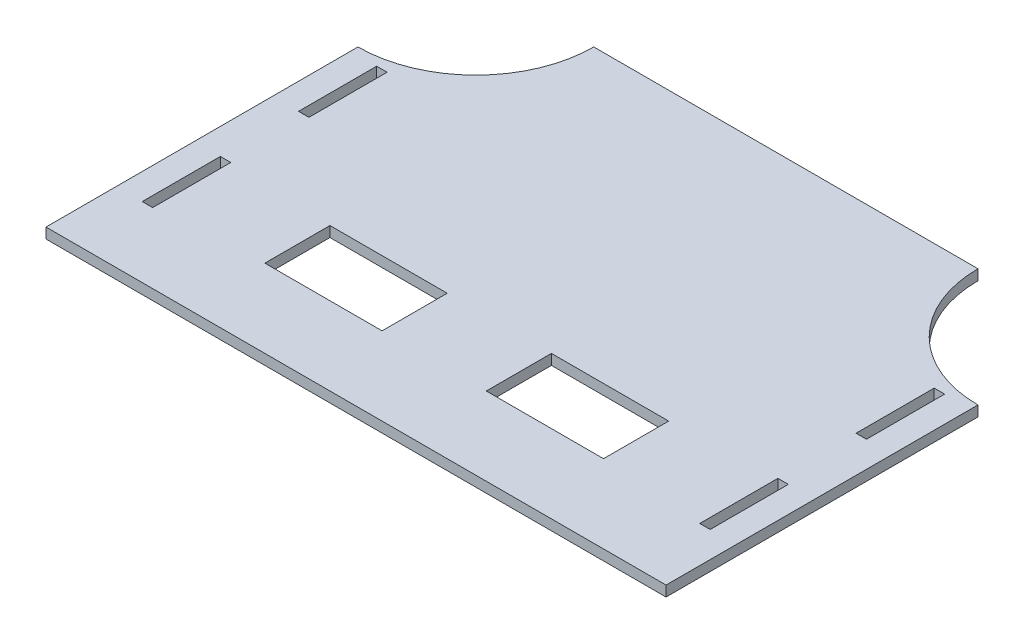
ISO-10303-21;
HEADER;
FILE_DESCRIPTION(('STEP AP214'),'2;1');
FILE_NAME('part.step','',(''),(''),'','','');
FILE_SCHEMA(('AUTOMOTIVE_DESIGN { 1 0 10303 214 1 1 1 1 }'));
ENDSEC;
DATA;
#1=APPLICATION_CONTEXT('core data for automotive mechanical design processes');
#2=APPLICATION_PROTOCOL_DEFINITION('international standard','automotive_design',2000,#1);
#3=PRODUCT_CONTEXT('',#1,'mechanical');
#4=PRODUCT('Part','Part','',(#3));
#5=PRODUCT_RELATED_PRODUCT_CATEGORY('part','',(#4));
#6=PRODUCT_DEFINITION_FORMATION('','',#4);
#7=PRODUCT_DEFINITION_CONTEXT('part definition',#1,'design');
#8=PRODUCT_DEFINITION('design','',#6,#7);
#9=PRODUCT_DEFINITION_SHAPE('','',#8);
#10=(LENGTH_UNIT() NAMED_UNIT(*) SI_UNIT(.MILLI.,.METRE.));
#11=(NAMED_UNIT(*) PLANE_ANGLE_UNIT() SI_UNIT($,.RADIAN.));
#12=(NAMED_UNIT(*) SI_UNIT($,.STERADIAN.) SOLID_ANGLE_UNIT());
#13=UNCERTAINTY_MEASURE_WITH_UNIT(LENGTH_MEASURE(1.E-05),#10,'distance_accuracy_value','');
#14=(GEOMETRIC_REPRESENTATION_CONTEXT(3) GLOBAL_UNCERTAINTY_ASSIGNED_CONTEXT((#13)) GLOBAL_UNIT_ASSIGNED_CONTEXT((#10,
#11,#12)) REPRESENTATION_CONTEXT('',''));
#15=CARTESIAN_POINT('',(0.,0.,0.));
#16=DIRECTION('',(0.,0.,1.));
#17=DIRECTION('',(1.,0.,0.));
#18=AXIS2_PLACEMENT_3D('',#15,#16,#17);
#19=CARTESIAN_POINT('',(0.,4.,0.));
#20=DIRECTION('',(1.,0.,0.));
#21=DIRECTION('',(0.,0.,-1.));
#22=AXIS2_PLACEMENT_3D('',#19,#20,#21);
#23=PLANE('',#22);
#24=DIRECTION('',(0.,0.,1.));
#25=VECTOR('',#24,1.);
#26=CARTESIAN_POINT('',(0.,4.,0.));
#27=LINE('',#26,#25);
#28=CARTESIAN_POINT('',(0.,4.,-119.73850139392));
#29=VERTEX_POINT('',#28);
#30=CARTESIAN_POINT('',(0.,4.,0.));
#31=VERTEX_POINT('',#30);
#32=EDGE_CURVE('E356',#29,#31,#27,.T.);
#33=ORIENTED_EDGE('',*,*,#32,.F.);
#34=DIRECTION('',(0.,1.,0.));
#35=VECTOR('',#34,1.);
#36=CARTESIAN_POINT('',(0.,-6.,-119.73850139392));
#37=LINE('',#36,#35);
#38=CARTESIAN_POINT('',(0.,0.,-119.73850139392));
#39=VERTEX_POINT('',#38);
#40=EDGE_CURVE('E365',#29,#39,#37,.F.);
#41=ORIENTED_EDGE('',*,*,#40,.T.);
#42=DIRECTION('',(0.,0.,1.));
#43=VECTOR('',#42,1.);
#44=CARTESIAN_POINT('',(0.,0.,0.));
#45=LINE('',#44,#43);
#46=CARTESIAN_POINT('',(0.,0.,0.));
#47=VERTEX_POINT('',#46);
#48=EDGE_CURVE('E345',#39,#47,#45,.T.);
#49=ORIENTED_EDGE('',*,*,#48,.T.);
#50=DIRECTION('',(0.,-1.,0.));
#51=VECTOR('',#50,1.);
#52=CARTESIAN_POINT('',(0.,4.,0.));
#53=LINE('',#52,#51);
#54=EDGE_CURVE('E359',#31,#47,#53,.T.);
#55=ORIENTED_EDGE('',*,*,#54,.F.);
#56=EDGE_LOOP('',(#33,#41,#49,#55));
#57=FACE_BOUND('',#56,.T.);
#58=ADVANCED_FACE('F40',(#57),#23,.F.);
#59=CARTESIAN_POINT('',(0.,4.,0.));
#60=DIRECTION('',(0.,0.,-1.));
#61=DIRECTION('',(-1.,0.,0.));
#62=AXIS2_PLACEMENT_3D('',#59,#60,#61);
#63=PLANE('',#62);
#64=DIRECTION('',(1.,0.,0.));
#65=VECTOR('',#64,1.);
#66=CARTESIAN_POINT('',(0.,0.,0.));
#67=LINE('',#66,#65);
#68=CARTESIAN_POINT('',(238.,0.,0.));
#69=VERTEX_POINT('',#68);
#70=EDGE_CURVE('E347',#47,#69,#67,.T.);
#71=ORIENTED_EDGE('',*,*,#70,.T.);
#72=DIRECTION('',(0.,-1.,0.));
#73=VECTOR('',#72,1.);
#74=CARTESIAN_POINT('',(238.,4.,0.));
#75=LINE('',#74,#73);
#76=CARTESIAN_POINT('',(238.,4.,0.));
#77=VERTEX_POINT('',#76);
#78=EDGE_CURVE('E342',#77,#69,#75,.T.);
#79=ORIENTED_EDGE('',*,*,#78,.F.);
#80=DIRECTION('',(1.,0.,0.));
#81=VECTOR('',#80,1.);
#82=CARTESIAN_POINT('',(0.,4.,0.));
#83=LINE('',#82,#81);
#84=EDGE_CURVE('E384',#31,#77,#83,.T.);
#85=ORIENTED_EDGE('',*,*,#84,.F.);
#86=ORIENTED_EDGE('',*,*,#54,.T.);
#87=EDGE_LOOP('',(#71,#79,#85,#86));
#88=FACE_BOUND('',#87,.T.);
#89=ADVANCED_FACE('F383',(#88),#63,.F.);
#90=CARTESIAN_POINT('',(238.,4.,0.));
#91=DIRECTION('',(-1.,0.,0.));
#92=DIRECTION('',(0.,0.,1.));
#93=AXIS2_PLACEMENT_3D('',#90,#91,#92);
#94=PLANE('',#93);
#95=DIRECTION('',(0.,0.,-1.));
#96=VECTOR('',#95,1.);
#97=CARTESIAN_POINT('',(238.,0.,0.));
#98=LINE('',#97,#96);
#99=CARTESIAN_POINT('',(238.,0.,-119.73850139392));
#100=VERTEX_POINT('',#99);
#101=EDGE_CURVE('E350',#69,#100,#98,.T.);
#102=ORIENTED_EDGE('',*,*,#101,.T.);
#103=DIRECTION('',(0.,1.,0.));
#104=VECTOR('',#103,1.);
#105=CARTESIAN_POINT('',(238.,-6.,-119.73850139392));
#106=LINE('',#105,#104);
#107=CARTESIAN_POINT('',(238.,4.,-119.73850139392));
#108=VERTEX_POINT('',#107);
#109=EDGE_CURVE('E913',#100,#108,#106,.T.);
#110=ORIENTED_EDGE('',*,*,#109,.T.);
#111=DIRECTION('',(0.,0.,-1.));
#112=VECTOR('',#111,1.);
#113=CARTESIAN_POINT('',(238.,4.,0.));
#114=LINE('',#113,#112);
#115=EDGE_CURVE('E343',#77,#108,#114,.T.);
#116=ORIENTED_EDGE('',*,*,#115,.F.);
#117=ORIENTED_EDGE('',*,*,#78,.T.);
#118=EDGE_LOOP('',(#102,#110,#116,#117));
#119=FACE_BOUND('',#118,.T.);
#120=ADVANCED_FACE('F607',(#119),#94,.F.);
#121=CARTESIAN_POINT('',(0.,4.,-165.));
#122=DIRECTION('',(0.,0.,1.));
#123=DIRECTION('',(1.,0.,0.));
#124=AXIS2_PLACEMENT_3D('',#121,#122,#123);
#125=PLANE('',#124);
#126=DIRECTION('',(-1.,0.,0.));
#127=VECTOR('',#126,1.);
#128=CARTESIAN_POINT('',(0.,4.,-165.));
#129=LINE('',#128,#127);
#130=CARTESIAN_POINT('',(192.73850139392,4.,-165.));
#131=VERTEX_POINT('',#130);
#132=CARTESIAN_POINT('',(45.2614986060804,4.,-165.));
#133=VERTEX_POINT('',#132);
#134=EDGE_CURVE('E337',#131,#133,#129,.T.);
#135=ORIENTED_EDGE('',*,*,#134,.F.);
#136=DIRECTION('',(0.,1.,0.));
#137=VECTOR('',#136,1.);
#138=CARTESIAN_POINT('',(192.73850139392,-6.,-165.));
#139=LINE('',#138,#137);
#140=CARTESIAN_POINT('',(192.73850139392,0.,-165.));
#141=VERTEX_POINT('',#140);
#142=EDGE_CURVE('E375',#131,#141,#139,.F.);
#143=ORIENTED_EDGE('',*,*,#142,.T.);
#144=DIRECTION('',(-1.,0.,0.));
#145=VECTOR('',#144,1.);
#146=CARTESIAN_POINT('',(0.,0.,-165.));
#147=LINE('',#146,#145);
#148=CARTESIAN_POINT('',(45.2614986060804,0.,-165.));
#149=VERTEX_POINT('',#148);
#150=EDGE_CURVE('E353',#141,#149,#147,.T.);
#151=ORIENTED_EDGE('',*,*,#150,.T.);
#152=DIRECTION('',(0.,1.,0.));
#153=VECTOR('',#152,1.);
#154=CARTESIAN_POINT('',(45.2614986060804,-6.,-165.));
#155=LINE('',#154,#153);
#156=EDGE_CURVE('E327',#149,#133,#155,.T.);
#157=ORIENTED_EDGE('',*,*,#156,.T.);
#158=EDGE_LOOP('',(#135,#143,#151,#157));
#159=FACE_BOUND('',#158,.T.);
#160=ADVANCED_FACE('F611',(#159),#125,.F.);
#161=CARTESIAN_POINT('',(0.,4.,0.));
#162=DIRECTION('',(0.,-1.,0.));
#163=DIRECTION('',(0.,0.,-1.));
#164=AXIS2_PLACEMENT_3D('',#161,#162,#163);
#165=PLANE('',#164);
#166=DIRECTION('',(1.,0.,0.));
#167=VECTOR('',#166,1.);
#168=CARTESIAN_POINT('',(139.,4.,-30.));
#169=LINE('',#168,#167);
#170=CARTESIAN_POINT('',(139.,4.,-30.));
#171=VERTEX_POINT('',#170);
#172=CARTESIAN_POINT('',(184.,4.,-30.));
#173=VERTEX_POINT('',#172);
#174=EDGE_CURVE('E268',#171,#173,#169,.T.);
#175=ORIENTED_EDGE('',*,*,#174,.F.);
#176=DIRECTION('',(0.,0.,1.));
#177=VECTOR('',#176,1.);
#178=CARTESIAN_POINT('',(139.,4.,-55.));
#179=LINE('',#178,#177);
#180=CARTESIAN_POINT('',(139.,4.,-55.));
#181=VERTEX_POINT('',#180);
#182=EDGE_CURVE('E54',#181,#171,#179,.T.);
#183=ORIENTED_EDGE('',*,*,#182,.F.);
#184=DIRECTION('',(-1.,0.,0.));
#185=VECTOR('',#184,1.);
#186=CARTESIAN_POINT('',(139.,4.,-55.));
#187=LINE('',#186,#185);
#188=CARTESIAN_POINT('',(184.,4.,-55.));
#189=VERTEX_POINT('',#188);
#190=EDGE_CURVE('E256',#189,#181,#187,.T.);
#191=ORIENTED_EDGE('',*,*,#190,.F.);
#192=DIRECTION('',(0.,0.,-1.));
#193=VECTOR('',#192,1.);
#194=CARTESIAN_POINT('',(184.,4.,-55.));
#195=LINE('',#194,#193);
#196=EDGE_CURVE('E260',#173,#189,#195,.T.);
#197=ORIENTED_EDGE('',*,*,#196,.F.);
#198=EDGE_LOOP('',(#175,#183,#191,#197));
#199=FACE_BOUND('',#198,.T.);
#200=DIRECTION('',(1.,0.,0.));
#201=VECTOR('',#200,1.);
#202=CARTESIAN_POINT('',(54.,4.,-30.));
#203=LINE('',#202,#201);
#204=CARTESIAN_POINT('',(54.,4.,-30.));
#205=VERTEX_POINT('',#204);
#206=CARTESIAN_POINT('',(99.,4.,-30.));
#207=VERTEX_POINT('',#206);
#208=EDGE_CURVE('E303',#205,#207,#203,.T.);
#209=ORIENTED_EDGE('',*,*,#208,.F.);
#210=DIRECTION('',(0.,0.,1.));
#211=VECTOR('',#210,1.);
#212=CARTESIAN_POINT('',(54.,4.,-55.));
#213=LINE('',#212,#211);
#214=CARTESIAN_POINT('',(54.,4.,-55.));
#215=VERTEX_POINT('',#214);
#216=EDGE_CURVE('E62',#215,#205,#213,.T.);
#217=ORIENTED_EDGE('',*,*,#216,.F.);
#218=DIRECTION('',(-1.,0.,0.));
#219=VECTOR('',#218,1.);
#220=CARTESIAN_POINT('',(54.,4.,-55.));
#221=LINE('',#220,#219);
#222=CARTESIAN_POINT('',(99.,4.,-55.));
#223=VERTEX_POINT('',#222);
#224=EDGE_CURVE('E290',#223,#215,#221,.T.);
#225=ORIENTED_EDGE('',*,*,#224,.F.);
#226=DIRECTION('',(0.,0.,-1.));
#227=VECTOR('',#226,1.);
#228=CARTESIAN_POINT('',(99.,4.,-55.));
#229=LINE('',#228,#227);
#230=EDGE_CURVE('E315',#207,#223,#229,.T.);
#231=ORIENTED_EDGE('',*,*,#230,.F.);
#232=EDGE_LOOP('',(#209,#217,#225,#231));
#233=FACE_BOUND('',#232,.T.);
#234=DIRECTION('',(-1.,0.,0.));
#235=VECTOR('',#234,1.);
#236=CARTESIAN_POINT('',(228.,4.,-56.9319010684802));
#237=LINE('',#236,#235);
#238=CARTESIAN_POINT('',(228.,4.,-56.9319010684802));
#239=VERTEX_POINT('',#238);
#240=CARTESIAN_POINT('',(224.,4.,-56.9319010684802));
#241=VERTEX_POINT('',#240);
#242=EDGE_CURVE('E532',#239,#241,#237,.T.);
#243=ORIENTED_EDGE('',*,*,#242,.F.);
#244=DIRECTION('',(0.,0.,-1.));
#245=VECTOR('',#244,1.);
#246=CARTESIAN_POINT('',(228.,4.,-56.9319010684802));
#247=LINE('',#246,#245);
#248=CARTESIAN_POINT('',(228.,4.,-26.9319010684802));
#249=VERTEX_POINT('',#248);
#250=EDGE_CURVE('E466',#249,#239,#247,.T.);
#251=ORIENTED_EDGE('',*,*,#250,.F.);
#252=DIRECTION('',(1.,0.,0.));
#253=VECTOR('',#252,1.);
#254=CARTESIAN_POINT('',(228.,4.,-26.9319010684802));
#255=LINE('',#254,#253);
#256=CARTESIAN_POINT('',(224.,4.,-26.9319010684802));
#257=VERTEX_POINT('',#256);
#258=EDGE_CURVE('E519',#257,#249,#255,.T.);
#259=ORIENTED_EDGE('',*,*,#258,.F.);
#260=DIRECTION('',(0.,0.,1.));
#261=VECTOR('',#260,1.);
#262=CARTESIAN_POINT('',(224.,4.,-56.9319010684802));
#263=LINE('',#262,#261);
#264=EDGE_CURVE('E543',#241,#257,#263,.T.);
#265=ORIENTED_EDGE('',*,*,#264,.F.);
#266=EDGE_LOOP('',(#243,#251,#259,#265));
#267=FACE_BOUND('',#266,.T.);
#268=DIRECTION('',(-1.,0.,0.));
#269=VECTOR('',#268,1.);
#270=CARTESIAN_POINT('',(14.,4.,-116.931901068479));
#271=LINE('',#270,#269);
#272=CARTESIAN_POINT('',(14.,4.,-116.931901068479));
#273=VERTEX_POINT('',#272);
#274=CARTESIAN_POINT('',(9.99999999999997,4.,-116.931901068479));
#275=VERTEX_POINT('',#274);
#276=EDGE_CURVE('E563',#273,#275,#271,.T.);
#277=ORIENTED_EDGE('',*,*,#276,.F.);
#278=DIRECTION('',(0.,0.,-1.));
#279=VECTOR('',#278,1.);
#280=CARTESIAN_POINT('',(14.,4.,-116.931901068479));
#281=LINE('',#280,#279);
#282=CARTESIAN_POINT('',(14.,4.,-86.931901068479));
#283=VERTEX_POINT('',#282);
#284=EDGE_CURVE('E506',#283,#273,#281,.T.);
#285=ORIENTED_EDGE('',*,*,#284,.F.);
#286=DIRECTION('',(1.,0.,0.));
#287=VECTOR('',#286,1.);
#288=CARTESIAN_POINT('',(14.,4.,-86.931901068479));
#289=LINE('',#288,#287);
#290=CARTESIAN_POINT('',(9.99999999999998,4.,-86.931901068479));
#291=VERTEX_POINT('',#290);
#292=EDGE_CURVE('E467',#291,#283,#289,.T.);
#293=ORIENTED_EDGE('',*,*,#292,.F.);
#294=DIRECTION('',(0.,0.,1.));
#295=VECTOR('',#294,1.);
#296=CARTESIAN_POINT('',(9.99999999999997,4.,-116.931901068479));
#297=LINE('',#296,#295);
#298=EDGE_CURVE('E473',#275,#291,#297,.T.);
#299=ORIENTED_EDGE('',*,*,#298,.F.);
#300=EDGE_LOOP('',(#277,#285,#293,#299));
#301=FACE_BOUND('',#300,.T.);
#302=DIRECTION('',(-1.,0.,0.));
#303=VECTOR('',#302,1.);
#304=CARTESIAN_POINT('',(14.,4.,-56.931901068479));
#305=LINE('',#304,#303);
#306=CARTESIAN_POINT('',(14.,4.,-56.931901068479));
#307=VERTEX_POINT('',#306);
#308=CARTESIAN_POINT('',(9.99999999999998,4.,-56.931901068479));
#309=VERTEX_POINT('',#308);
#310=EDGE_CURVE('E486',#307,#309,#305,.T.);
#311=ORIENTED_EDGE('',*,*,#310,.F.);
#312=DIRECTION('',(0.,0.,-1.));
#313=VECTOR('',#312,1.);
#314=CARTESIAN_POINT('',(14.,4.,-56.931901068479));
#315=LINE('',#314,#313);
#316=CARTESIAN_POINT('',(14.,4.,-26.931901068479));
#317=VERTEX_POINT('',#316);
#318=EDGE_CURVE('E492',#317,#307,#315,.T.);
#319=ORIENTED_EDGE('',*,*,#318,.F.);
#320=DIRECTION('',(1.,0.,0.));
#321=VECTOR('',#320,1.);
#322=CARTESIAN_POINT('',(14.,4.,-26.931901068479));
#323=LINE('',#322,#321);
#324=CARTESIAN_POINT('',(9.99999999999998,4.,-26.931901068479));
#325=VERTEX_POINT('',#324);
#326=EDGE_CURVE('E498',#325,#317,#323,.T.);
#327=ORIENTED_EDGE('',*,*,#326,.F.);
#328=DIRECTION('',(0.,0.,1.));
#329=VECTOR('',#328,1.);
#330=CARTESIAN_POINT('',(9.99999999999998,4.,-56.931901068479));
#331=LINE('',#330,#329);
#332=EDGE_CURVE('E491',#309,#325,#331,.T.);
#333=ORIENTED_EDGE('',*,*,#332,.F.);
#334=EDGE_LOOP('',(#311,#319,#327,#333));
#335=FACE_BOUND('',#334,.T.);
#336=DIRECTION('',(-1.,0.,0.));
#337=VECTOR('',#336,1.);
#338=CARTESIAN_POINT('',(228.,4.,-116.93190106848));
#339=LINE('',#338,#337);
#340=CARTESIAN_POINT('',(228.,4.,-116.93190106848));
#341=VERTEX_POINT('',#340);
#342=CARTESIAN_POINT('',(224.,4.,-116.93190106848));
#343=VERTEX_POINT('',#342);
#344=EDGE_CURVE('E422',#341,#343,#339,.T.);
#345=ORIENTED_EDGE('',*,*,#344,.F.);
#346=DIRECTION('',(0.,0.,-1.));
#347=VECTOR('',#346,1.);
#348=CARTESIAN_POINT('',(228.,4.,-116.93190106848));
#349=LINE('',#348,#347);
#350=CARTESIAN_POINT('',(228.,4.,-86.9319010684802));
#351=VERTEX_POINT('',#350);
#352=EDGE_CURVE('E418',#351,#341,#349,.T.);
#353=ORIENTED_EDGE('',*,*,#352,.F.);
#354=DIRECTION('',(1.,0.,0.));
#355=VECTOR('',#354,1.);
#356=CARTESIAN_POINT('',(228.,4.,-86.9319010684802));
#357=LINE('',#356,#355);
#358=CARTESIAN_POINT('',(224.,4.,-86.9319010684802));
#359=VERTEX_POINT('',#358);
#360=EDGE_CURVE('E404',#359,#351,#357,.T.);
#361=ORIENTED_EDGE('',*,*,#360,.F.);
#362=DIRECTION('',(0.,0.,1.));
#363=VECTOR('',#362,1.);
#364=CARTESIAN_POINT('',(224.,4.,-116.93190106848));
#365=LINE('',#364,#363);
#366=EDGE_CURVE('E410',#343,#359,#365,.T.);
#367=ORIENTED_EDGE('',*,*,#366,.F.);
#368=EDGE_LOOP('',(#345,#353,#361,#367));
#369=FACE_BOUND('',#368,.T.);
#370=ORIENTED_EDGE('',*,*,#115,.T.);
#371=CARTESIAN_POINT('',(238.,4.,-165.));
#372=DIRECTION('',(0.,1.,0.));
#373=DIRECTION('',(0.,0.,1.));
#374=AXIS2_PLACEMENT_3D('',#371,#372,#373);
#375=CIRCLE('',#374,45.2614986060804);
#376=EDGE_CURVE('E323',#131,#108,#375,.T.);
#377=ORIENTED_EDGE('',*,*,#376,.F.);
#378=ORIENTED_EDGE('',*,*,#134,.T.);
#379=CARTESIAN_POINT('',(0.,4.,-165.));
#380=DIRECTION('',(0.,1.,0.));
#381=DIRECTION('',(0.,0.,1.));
#382=AXIS2_PLACEMENT_3D('',#379,#380,#381);
#383=CIRCLE('',#382,45.2614986060804);
#384=EDGE_CURVE('E282',#29,#133,#383,.T.);
#385=ORIENTED_EDGE('',*,*,#384,.F.);
#386=ORIENTED_EDGE('',*,*,#32,.T.);
#387=ORIENTED_EDGE('',*,*,#84,.T.);
#388=EDGE_LOOP('',(#370,#377,#378,#385,#386,#387));
#389=FACE_BOUND('',#388,.T.);
#390=ADVANCED_FACE('F441',(#199,#233,#267,#301,#335,#369,#389),#165,.F.);
#391=CARTESIAN_POINT('',(0.,0.,0.));
#392=DIRECTION('',(0.,-1.,0.));
#393=DIRECTION('',(0.,0.,-1.));
#394=AXIS2_PLACEMENT_3D('',#391,#392,#393);
#395=PLANE('',#394);
#396=DIRECTION('',(0.,0.,1.));
#397=VECTOR('',#396,1.);
#398=CARTESIAN_POINT('',(139.,0.,-55.));
#399=LINE('',#398,#397);
#400=CARTESIAN_POINT('',(139.,0.,-55.));
#401=VERTEX_POINT('',#400);
#402=CARTESIAN_POINT('',(139.,0.,-30.));
#403=VERTEX_POINT('',#402);
#404=EDGE_CURVE('E237',#401,#403,#399,.T.);
#405=ORIENTED_EDGE('',*,*,#404,.T.);
#406=DIRECTION('',(1.,0.,0.));
#407=VECTOR('',#406,1.);
#408=CARTESIAN_POINT('',(139.,0.,-30.));
#409=LINE('',#408,#407);
#410=CARTESIAN_POINT('',(184.,0.,-30.));
#411=VERTEX_POINT('',#410);
#412=EDGE_CURVE('E247',#403,#411,#409,.T.);
#413=ORIENTED_EDGE('',*,*,#412,.T.);
#414=DIRECTION('',(0.,0.,-1.));
#415=VECTOR('',#414,1.);
#416=CARTESIAN_POINT('',(184.,0.,-55.));
#417=LINE('',#416,#415);
#418=CARTESIAN_POINT('',(184.,0.,-55.));
#419=VERTEX_POINT('',#418);
#420=EDGE_CURVE('E251',#411,#419,#417,.T.);
#421=ORIENTED_EDGE('',*,*,#420,.T.);
#422=DIRECTION('',(-1.,0.,0.));
#423=VECTOR('',#422,1.);
#424=CARTESIAN_POINT('',(139.,0.,-55.));
#425=LINE('',#424,#423);
#426=EDGE_CURVE('E243',#419,#401,#425,.T.);
#427=ORIENTED_EDGE('',*,*,#426,.T.);
#428=EDGE_LOOP('',(#405,#413,#421,#427));
#429=FACE_BOUND('',#428,.T.);
#430=DIRECTION('',(0.,0.,1.));
#431=VECTOR('',#430,1.);
#432=CARTESIAN_POINT('',(54.,0.,-55.));
#433=LINE('',#432,#431);
#434=CARTESIAN_POINT('',(54.,0.,-55.));
#435=VERTEX_POINT('',#434);
#436=CARTESIAN_POINT('',(54.,0.,-30.));
#437=VERTEX_POINT('',#436);
#438=EDGE_CURVE('E286',#435,#437,#433,.T.);
#439=ORIENTED_EDGE('',*,*,#438,.T.);
#440=DIRECTION('',(1.,0.,0.));
#441=VECTOR('',#440,1.);
#442=CARTESIAN_POINT('',(54.,0.,-30.));
#443=LINE('',#442,#441);
#444=CARTESIAN_POINT('',(99.,0.,-30.));
#445=VERTEX_POINT('',#444);
#446=EDGE_CURVE('E289',#437,#445,#443,.T.);
#447=ORIENTED_EDGE('',*,*,#446,.T.);
#448=DIRECTION('',(0.,0.,-1.));
#449=VECTOR('',#448,1.);
#450=CARTESIAN_POINT('',(99.,0.,-55.));
#451=LINE('',#450,#449);
#452=CARTESIAN_POINT('',(99.,0.,-55.));
#453=VERTEX_POINT('',#452);
#454=EDGE_CURVE('E293',#445,#453,#451,.T.);
#455=ORIENTED_EDGE('',*,*,#454,.T.);
#456=DIRECTION('',(-1.,0.,0.));
#457=VECTOR('',#456,1.);
#458=CARTESIAN_POINT('',(54.,0.,-55.));
#459=LINE('',#458,#457);
#460=EDGE_CURVE('E296',#453,#435,#459,.T.);
#461=ORIENTED_EDGE('',*,*,#460,.T.);
#462=EDGE_LOOP('',(#439,#447,#455,#461));
#463=FACE_BOUND('',#462,.T.);
#464=CARTESIAN_POINT('',(238.,0.,-165.));
#465=DIRECTION('',(0.,-1.,0.));
#466=DIRECTION('',(0.,0.,-1.));
#467=AXIS2_PLACEMENT_3D('',#464,#465,#466);
#468=CIRCLE('',#467,45.2614986060804);
#469=EDGE_CURVE('E12',#100,#141,#468,.T.);
#470=ORIENTED_EDGE('',*,*,#469,.F.);
#471=ORIENTED_EDGE('',*,*,#101,.F.);
#472=ORIENTED_EDGE('',*,*,#70,.F.);
#473=ORIENTED_EDGE('',*,*,#48,.F.);
#474=CARTESIAN_POINT('',(0.,0.,-165.));
#475=DIRECTION('',(0.,-1.,0.));
#476=DIRECTION('',(0.,0.,-1.));
#477=AXIS2_PLACEMENT_3D('',#474,#475,#476);
#478=CIRCLE('',#477,45.2614986060804);
#479=EDGE_CURVE('E47',#149,#39,#478,.T.);
#480=ORIENTED_EDGE('',*,*,#479,.F.);
#481=ORIENTED_EDGE('',*,*,#150,.F.);
#482=EDGE_LOOP('',(#470,#471,#472,#473,#480,#481));
#483=FACE_BOUND('',#482,.T.);
#484=DIRECTION('',(0.,0.,-1.));
#485=VECTOR('',#484,1.);
#486=CARTESIAN_POINT('',(228.,0.,-56.9319010684802));
#487=LINE('',#486,#485);
#488=CARTESIAN_POINT('',(228.,0.,-26.9319010684802));
#489=VERTEX_POINT('',#488);
#490=CARTESIAN_POINT('',(228.,0.,-56.9319010684802));
#491=VERTEX_POINT('',#490);
#492=EDGE_CURVE('E515',#489,#491,#487,.T.);
#493=ORIENTED_EDGE('',*,*,#492,.T.);
#494=DIRECTION('',(-1.,0.,0.));
#495=VECTOR('',#494,1.);
#496=CARTESIAN_POINT('',(228.,0.,-56.9319010684802));
#497=LINE('',#496,#495);
#498=CARTESIAN_POINT('',(224.,0.,-56.9319010684802));
#499=VERTEX_POINT('',#498);
#500=EDGE_CURVE('E518',#491,#499,#497,.T.);
#501=ORIENTED_EDGE('',*,*,#500,.T.);
#502=DIRECTION('',(0.,0.,1.));
#503=VECTOR('',#502,1.);
#504=CARTESIAN_POINT('',(224.,0.,-56.9319010684802));
#505=LINE('',#504,#503);
#506=CARTESIAN_POINT('',(224.,0.,-26.9319010684802));
#507=VERTEX_POINT('',#506);
#508=EDGE_CURVE('E522',#499,#507,#505,.T.);
#509=ORIENTED_EDGE('',*,*,#508,.T.);
#510=DIRECTION('',(1.,0.,0.));
#511=VECTOR('',#510,1.);
#512=CARTESIAN_POINT('',(228.,0.,-26.9319010684802));
#513=LINE('',#512,#511);
#514=EDGE_CURVE('E525',#507,#489,#513,.T.);
#515=ORIENTED_EDGE('',*,*,#514,.T.);
#516=EDGE_LOOP('',(#493,#501,#509,#515));
#517=FACE_BOUND('',#516,.T.);
#518=DIRECTION('',(0.,0.,-1.));
#519=VECTOR('',#518,1.);
#520=CARTESIAN_POINT('',(14.,0.,-116.931901068479));
#521=LINE('',#520,#519);
#522=CARTESIAN_POINT('',(14.,0.,-86.931901068479));
#523=VERTEX_POINT('',#522);
#524=CARTESIAN_POINT('',(14.,0.,-116.931901068479));
#525=VERTEX_POINT('',#524);
#526=EDGE_CURVE('E472',#523,#525,#521,.T.);
#527=ORIENTED_EDGE('',*,*,#526,.T.);
#528=DIRECTION('',(-1.,0.,0.));
#529=VECTOR('',#528,1.);
#530=CARTESIAN_POINT('',(14.,0.,-116.931901068479));
#531=LINE('',#530,#529);
#532=CARTESIAN_POINT('',(9.99999999999997,0.,-116.931901068479));
#533=VERTEX_POINT('',#532);
#534=EDGE_CURVE('E554',#525,#533,#531,.T.);
#535=ORIENTED_EDGE('',*,*,#534,.T.);
#536=DIRECTION('',(0.,0.,1.));
#537=VECTOR('',#536,1.);
#538=CARTESIAN_POINT('',(9.99999999999997,0.,-116.931901068479));
#539=LINE('',#538,#537);
#540=CARTESIAN_POINT('',(9.99999999999998,0.,-86.931901068479));
#541=VERTEX_POINT('',#540);
#542=EDGE_CURVE('E557',#533,#541,#539,.T.);
#543=ORIENTED_EDGE('',*,*,#542,.T.);
#544=DIRECTION('',(1.,0.,0.));
#545=VECTOR('',#544,1.);
#546=CARTESIAN_POINT('',(14.,0.,-86.931901068479));
#547=LINE('',#546,#545);
#548=EDGE_CURVE('E460',#541,#523,#547,.T.);
#549=ORIENTED_EDGE('',*,*,#548,.T.);
#550=EDGE_LOOP('',(#527,#535,#543,#549));
#551=FACE_BOUND('',#550,.T.);
#552=DIRECTION('',(0.,0.,-1.));
#553=VECTOR('',#552,1.);
#554=CARTESIAN_POINT('',(14.,0.,-56.931901068479));
#555=LINE('',#554,#553);
#556=CARTESIAN_POINT('',(14.,0.,-26.931901068479));
#557=VERTEX_POINT('',#556);
#558=CARTESIAN_POINT('',(14.,0.,-56.931901068479));
#559=VERTEX_POINT('',#558);
#560=EDGE_CURVE('E503',#557,#559,#555,.T.);
#561=ORIENTED_EDGE('',*,*,#560,.T.);
#562=DIRECTION('',(-1.,0.,0.));
#563=VECTOR('',#562,1.);
#564=CARTESIAN_POINT('',(14.,0.,-56.931901068479));
#565=LINE('',#564,#563);
#566=CARTESIAN_POINT('',(9.99999999999998,0.,-56.931901068479));
#567=VERTEX_POINT('',#566);
#568=EDGE_CURVE('E920',#559,#567,#565,.T.);
#569=ORIENTED_EDGE('',*,*,#568,.T.);
#570=DIRECTION('',(0.,0.,1.));
#571=VECTOR('',#570,1.);
#572=CARTESIAN_POINT('',(9.99999999999998,0.,-56.931901068479));
#573=LINE('',#572,#571);
#574=CARTESIAN_POINT('',(9.99999999999998,0.,-26.931901068479));
#575=VERTEX_POINT('',#574);
#576=EDGE_CURVE('E923',#567,#575,#573,.T.);
#577=ORIENTED_EDGE('',*,*,#576,.T.);
#578=DIRECTION('',(1.,0.,0.));
#579=VECTOR('',#578,1.);
#580=CARTESIAN_POINT('',(14.,0.,-26.931901068479));
#581=LINE('',#580,#579);
#582=EDGE_CURVE('E514',#575,#557,#581,.T.);
#583=ORIENTED_EDGE('',*,*,#582,.T.);
#584=EDGE_LOOP('',(#561,#569,#577,#583));
#585=FACE_BOUND('',#584,.T.);
#586=DIRECTION('',(0.,0.,-1.));
#587=VECTOR('',#586,1.);
#588=CARTESIAN_POINT('',(228.,0.,-116.93190106848));
#589=LINE('',#588,#587);
#590=CARTESIAN_POINT('',(228.,0.,-86.9319010684802));
#591=VERTEX_POINT('',#590);
#592=CARTESIAN_POINT('',(228.,0.,-116.93190106848));
#593=VERTEX_POINT('',#592);
#594=EDGE_CURVE('E409',#591,#593,#589,.T.);
#595=ORIENTED_EDGE('',*,*,#594,.T.);
#596=DIRECTION('',(-1.,0.,0.));
#597=VECTOR('',#596,1.);
#598=CARTESIAN_POINT('',(228.,0.,-116.93190106848));
#599=LINE('',#598,#597);
#600=CARTESIAN_POINT('',(224.,0.,-116.93190106848));
#601=VERTEX_POINT('',#600);
#602=EDGE_CURVE('E452',#593,#601,#599,.T.);
#603=ORIENTED_EDGE('',*,*,#602,.T.);
#604=DIRECTION('',(0.,0.,1.));
#605=VECTOR('',#604,1.);
#606=CARTESIAN_POINT('',(224.,0.,-116.93190106848));
#607=LINE('',#606,#605);
#608=CARTESIAN_POINT('',(224.,0.,-86.9319010684802));
#609=VERTEX_POINT('',#608);
#610=EDGE_CURVE('E449',#601,#609,#607,.T.);
#611=ORIENTED_EDGE('',*,*,#610,.T.);
#612=DIRECTION('',(1.,0.,0.));
#613=VECTOR('',#612,1.);
#614=CARTESIAN_POINT('',(228.,0.,-86.9319010684802));
#615=LINE('',#614,#613);
#616=EDGE_CURVE('E399',#609,#591,#615,.T.);
#617=ORIENTED_EDGE('',*,*,#616,.T.);
#618=EDGE_LOOP('',(#595,#603,#611,#617));
#619=FACE_BOUND('',#618,.T.);
#620=ADVANCED_FACE('F253',(#429,#463,#483,#517,#551,#585,#619),#395,.T.);
#621=CARTESIAN_POINT('',(228.,0.,-116.93190106848));
#622=DIRECTION('',(1.,0.,0.));
#623=DIRECTION('',(0.,0.,-1.));
#624=AXIS2_PLACEMENT_3D('',#621,#622,#623);
#625=PLANE('',#624);
#626=ORIENTED_EDGE('',*,*,#352,.T.);
#627=DIRECTION('',(0.,1.,0.));
#628=VECTOR('',#627,1.);
#629=CARTESIAN_POINT('',(228.,0.,-116.93190106848));
#630=LINE('',#629,#628);
#631=EDGE_CURVE('E395',#593,#341,#630,.T.);
#632=ORIENTED_EDGE('',*,*,#631,.F.);
#633=ORIENTED_EDGE('',*,*,#594,.F.);
#634=DIRECTION('',(0.,1.,0.));
#635=VECTOR('',#634,1.);
#636=CARTESIAN_POINT('',(228.,0.,-86.9319010684802));
#637=LINE('',#636,#635);
#638=EDGE_CURVE('E348',#591,#351,#637,.T.);
#639=ORIENTED_EDGE('',*,*,#638,.T.);
#640=EDGE_LOOP('',(#626,#632,#633,#639));
#641=FACE_BOUND('',#640,.T.);
#642=ADVANCED_FACE('F620',(#641),#625,.F.);
#643=CARTESIAN_POINT('',(228.,0.,-86.9319010684802));
#644=DIRECTION('',(0.,0.,1.));
#645=DIRECTION('',(1.,0.,0.));
#646=AXIS2_PLACEMENT_3D('',#643,#644,#645);
#647=PLANE('',#646);
#648=ORIENTED_EDGE('',*,*,#360,.T.);
#649=ORIENTED_EDGE('',*,*,#638,.F.);
#650=ORIENTED_EDGE('',*,*,#616,.F.);
#651=DIRECTION('',(0.,1.,0.));
#652=VECTOR('',#651,1.);
#653=CARTESIAN_POINT('',(224.,0.,-86.9319010684802));
#654=LINE('',#653,#652);
#655=EDGE_CURVE('E401',#609,#359,#654,.T.);
#656=ORIENTED_EDGE('',*,*,#655,.T.);
#657=EDGE_LOOP('',(#648,#649,#650,#656));
#658=FACE_BOUND('',#657,.T.);
#659=ADVANCED_FACE('F443',(#658),#647,.F.);
#660=CARTESIAN_POINT('',(224.,0.,-116.93190106848));
#661=DIRECTION('',(-1.,0.,0.));
#662=DIRECTION('',(0.,0.,1.));
#663=AXIS2_PLACEMENT_3D('',#660,#661,#662);
#664=PLANE('',#663);
#665=ORIENTED_EDGE('',*,*,#366,.T.);
#666=ORIENTED_EDGE('',*,*,#655,.F.);
#667=ORIENTED_EDGE('',*,*,#610,.F.);
#668=DIRECTION('',(0.,1.,0.));
#669=VECTOR('',#668,1.);
#670=CARTESIAN_POINT('',(224.,0.,-116.93190106848));
#671=LINE('',#670,#669);
#672=EDGE_CURVE('E398',#601,#343,#671,.T.);
#673=ORIENTED_EDGE('',*,*,#672,.T.);
#674=EDGE_LOOP('',(#665,#666,#667,#673));
#675=FACE_BOUND('',#674,.T.);
#676=ADVANCED_FACE('F437',(#675),#664,.F.);
#677=CARTESIAN_POINT('',(228.,0.,-116.93190106848));
#678=DIRECTION('',(0.,0.,-1.));
#679=DIRECTION('',(-1.,0.,0.));
#680=AXIS2_PLACEMENT_3D('',#677,#678,#679);
#681=PLANE('',#680);
#682=ORIENTED_EDGE('',*,*,#344,.T.);
#683=ORIENTED_EDGE('',*,*,#672,.F.);
#684=ORIENTED_EDGE('',*,*,#602,.F.);
#685=ORIENTED_EDGE('',*,*,#631,.T.);
#686=EDGE_LOOP('',(#682,#683,#684,#685));
#687=FACE_BOUND('',#686,.T.);
#688=ADVANCED_FACE('F627',(#687),#681,.F.);
#689=CARTESIAN_POINT('',(14.,0.,-56.931901068479));
#690=DIRECTION('',(1.,0.,0.));
#691=DIRECTION('',(0.,0.,-1.));
#692=AXIS2_PLACEMENT_3D('',#689,#690,#691);
#693=PLANE('',#692);
#694=ORIENTED_EDGE('',*,*,#318,.T.);
#695=DIRECTION('',(0.,1.,0.));
#696=VECTOR('',#695,1.);
#697=CARTESIAN_POINT('',(14.,0.,-56.931901068479));
#698=LINE('',#697,#696);
#699=EDGE_CURVE('E511',#559,#307,#698,.T.);
#700=ORIENTED_EDGE('',*,*,#699,.F.);
#701=ORIENTED_EDGE('',*,*,#560,.F.);
#702=DIRECTION('',(0.,1.,0.));
#703=VECTOR('',#702,1.);
#704=CARTESIAN_POINT('',(14.,0.,-26.931901068479));
#705=LINE('',#704,#703);
#706=EDGE_CURVE('E504',#557,#317,#705,.T.);
#707=ORIENTED_EDGE('',*,*,#706,.T.);
#708=EDGE_LOOP('',(#694,#700,#701,#707));
#709=FACE_BOUND('',#708,.T.);
#710=ADVANCED_FACE('F630',(#709),#693,.F.);
#711=CARTESIAN_POINT('',(14.,0.,-26.931901068479));
#712=DIRECTION('',(0.,0.,1.));
#713=DIRECTION('',(1.,0.,0.));
#714=AXIS2_PLACEMENT_3D('',#711,#712,#713);
#715=PLANE('',#714);
#716=ORIENTED_EDGE('',*,*,#326,.T.);
#717=ORIENTED_EDGE('',*,*,#706,.F.);
#718=ORIENTED_EDGE('',*,*,#582,.F.);
#719=DIRECTION('',(0.,1.,0.));
#720=VECTOR('',#719,1.);
#721=CARTESIAN_POINT('',(9.99999999999998,0.,-26.931901068479));
#722=LINE('',#721,#720);
#723=EDGE_CURVE('E507',#575,#325,#722,.T.);
#724=ORIENTED_EDGE('',*,*,#723,.T.);
#725=EDGE_LOOP('',(#716,#717,#718,#724));
#726=FACE_BOUND('',#725,.T.);
#727=ADVANCED_FACE('F651',(#726),#715,.F.);
#728=CARTESIAN_POINT('',(9.99999999999998,0.,-56.931901068479));
#729=DIRECTION('',(-1.,0.,0.));
#730=DIRECTION('',(0.,0.,1.));
#731=AXIS2_PLACEMENT_3D('',#728,#729,#730);
#732=PLANE('',#731);
#733=ORIENTED_EDGE('',*,*,#332,.T.);
#734=ORIENTED_EDGE('',*,*,#723,.F.);
#735=ORIENTED_EDGE('',*,*,#576,.F.);
#736=DIRECTION('',(0.,1.,0.));
#737=VECTOR('',#736,1.);
#738=CARTESIAN_POINT('',(9.99999999999998,0.,-56.931901068479));
#739=LINE('',#738,#737);
#740=EDGE_CURVE('E509',#567,#309,#739,.T.);
#741=ORIENTED_EDGE('',*,*,#740,.T.);
#742=EDGE_LOOP('',(#733,#734,#735,#741));
#743=FACE_BOUND('',#742,.T.);
#744=ADVANCED_FACE('F598',(#743),#732,.F.);
#745=CARTESIAN_POINT('',(14.,0.,-56.931901068479));
#746=DIRECTION('',(0.,0.,-1.));
#747=DIRECTION('',(-1.,0.,0.));
#748=AXIS2_PLACEMENT_3D('',#745,#746,#747);
#749=PLANE('',#748);
#750=ORIENTED_EDGE('',*,*,#310,.T.);
#751=ORIENTED_EDGE('',*,*,#740,.F.);
#752=ORIENTED_EDGE('',*,*,#568,.F.);
#753=ORIENTED_EDGE('',*,*,#699,.T.);
#754=EDGE_LOOP('',(#750,#751,#752,#753));
#755=FACE_BOUND('',#754,.T.);
#756=ADVANCED_FACE('F591',(#755),#749,.F.);
#757=CARTESIAN_POINT('',(14.,0.,-116.931901068479));
#758=DIRECTION('',(1.,0.,0.));
#759=DIRECTION('',(0.,0.,-1.));
#760=AXIS2_PLACEMENT_3D('',#757,#758,#759);
#761=PLANE('',#760);
#762=ORIENTED_EDGE('',*,*,#284,.T.);
#763=DIRECTION('',(0.,1.,0.));
#764=VECTOR('',#763,1.);
#765=CARTESIAN_POINT('',(14.,0.,-116.931901068479));
#766=LINE('',#765,#764);
#767=EDGE_CURVE('E456',#525,#273,#766,.T.);
#768=ORIENTED_EDGE('',*,*,#767,.F.);
#769=ORIENTED_EDGE('',*,*,#526,.F.);
#770=DIRECTION('',(0.,1.,0.));
#771=VECTOR('',#770,1.);
#772=CARTESIAN_POINT('',(14.,0.,-86.931901068479));
#773=LINE('',#772,#771);
#774=EDGE_CURVE('E464',#523,#283,#773,.T.);
#775=ORIENTED_EDGE('',*,*,#774,.T.);
#776=EDGE_LOOP('',(#762,#768,#769,#775));
#777=FACE_BOUND('',#776,.T.);
#778=ADVANCED_FACE('F589',(#777),#761,.F.);
#779=CARTESIAN_POINT('',(14.,0.,-86.931901068479));
#780=DIRECTION('',(0.,0.,1.));
#781=DIRECTION('',(1.,0.,0.));
#782=AXIS2_PLACEMENT_3D('',#779,#780,#781);
#783=PLANE('',#782);
#784=ORIENTED_EDGE('',*,*,#292,.T.);
#785=ORIENTED_EDGE('',*,*,#774,.F.);
#786=ORIENTED_EDGE('',*,*,#548,.F.);
#787=DIRECTION('',(0.,1.,0.));
#788=VECTOR('',#787,1.);
#789=CARTESIAN_POINT('',(9.99999999999998,0.,-86.931901068479));
#790=LINE('',#789,#788);
#791=EDGE_CURVE('E462',#541,#291,#790,.T.);
#792=ORIENTED_EDGE('',*,*,#791,.T.);
#793=EDGE_LOOP('',(#784,#785,#786,#792));
#794=FACE_BOUND('',#793,.T.);
#795=ADVANCED_FACE('F582',(#794),#783,.F.);
#796=CARTESIAN_POINT('',(9.99999999999997,0.,-116.931901068479));
#797=DIRECTION('',(-1.,0.,0.));
#798=DIRECTION('',(0.,0.,1.));
#799=AXIS2_PLACEMENT_3D('',#796,#797,#798);
#800=PLANE('',#799);
#801=ORIENTED_EDGE('',*,*,#298,.T.);
#802=ORIENTED_EDGE('',*,*,#791,.F.);
#803=ORIENTED_EDGE('',*,*,#542,.F.);
#804=DIRECTION('',(0.,1.,0.));
#805=VECTOR('',#804,1.);
#806=CARTESIAN_POINT('',(9.99999999999997,0.,-116.931901068479));
#807=LINE('',#806,#805);
#808=EDGE_CURVE('E459',#533,#275,#807,.T.);
#809=ORIENTED_EDGE('',*,*,#808,.T.);
#810=EDGE_LOOP('',(#801,#802,#803,#809));
#811=FACE_BOUND('',#810,.T.);
#812=ADVANCED_FACE('F576',(#811),#800,.F.);
#813=CARTESIAN_POINT('',(14.,0.,-116.931901068479));
#814=DIRECTION('',(0.,0.,-1.));
#815=DIRECTION('',(-1.,0.,0.));
#816=AXIS2_PLACEMENT_3D('',#813,#814,#815);
#817=PLANE('',#816);
#818=ORIENTED_EDGE('',*,*,#276,.T.);
#819=ORIENTED_EDGE('',*,*,#808,.F.);
#820=ORIENTED_EDGE('',*,*,#534,.F.);
#821=ORIENTED_EDGE('',*,*,#767,.T.);
#822=EDGE_LOOP('',(#818,#819,#820,#821));
#823=FACE_BOUND('',#822,.T.);
#824=ADVANCED_FACE('F587',(#823),#817,.F.);
#825=CARTESIAN_POINT('',(228.,0.,-56.9319010684802));
#826=DIRECTION('',(1.,0.,0.));
#827=DIRECTION('',(0.,0.,-1.));
#828=AXIS2_PLACEMENT_3D('',#825,#826,#827);
#829=PLANE('',#828);
#830=ORIENTED_EDGE('',*,*,#250,.T.);
#831=DIRECTION('',(0.,1.,0.));
#832=VECTOR('',#831,1.);
#833=CARTESIAN_POINT('',(228.,0.,-56.9319010684802));
#834=LINE('',#833,#832);
#835=EDGE_CURVE('E528',#491,#239,#834,.T.);
#836=ORIENTED_EDGE('',*,*,#835,.F.);
#837=ORIENTED_EDGE('',*,*,#492,.F.);
#838=DIRECTION('',(0.,1.,0.));
#839=VECTOR('',#838,1.);
#840=CARTESIAN_POINT('',(228.,0.,-26.9319010684802));
#841=LINE('',#840,#839);
#842=EDGE_CURVE('E423',#489,#249,#841,.T.);
#843=ORIENTED_EDGE('',*,*,#842,.T.);
#844=EDGE_LOOP('',(#830,#836,#837,#843));
#845=FACE_BOUND('',#844,.T.);
#846=ADVANCED_FACE('F698',(#845),#829,.F.);
#847=CARTESIAN_POINT('',(228.,0.,-26.9319010684802));
#848=DIRECTION('',(0.,0.,1.));
#849=DIRECTION('',(1.,0.,0.));
#850=AXIS2_PLACEMENT_3D('',#847,#848,#849);
#851=PLANE('',#850);
#852=ORIENTED_EDGE('',*,*,#258,.T.);
#853=ORIENTED_EDGE('',*,*,#842,.F.);
#854=ORIENTED_EDGE('',*,*,#514,.F.);
#855=DIRECTION('',(0.,1.,0.));
#856=VECTOR('',#855,1.);
#857=CARTESIAN_POINT('',(224.,0.,-26.9319010684802));
#858=LINE('',#857,#856);
#859=EDGE_CURVE('E546',#507,#257,#858,.T.);
#860=ORIENTED_EDGE('',*,*,#859,.T.);
#861=EDGE_LOOP('',(#852,#853,#854,#860));
#862=FACE_BOUND('',#861,.T.);
#863=ADVANCED_FACE('F706',(#862),#851,.F.);
#864=CARTESIAN_POINT('',(224.,0.,-56.9319010684802));
#865=DIRECTION('',(-1.,0.,0.));
#866=DIRECTION('',(0.,0.,1.));
#867=AXIS2_PLACEMENT_3D('',#864,#865,#866);
#868=PLANE('',#867);
#869=ORIENTED_EDGE('',*,*,#264,.T.);
#870=ORIENTED_EDGE('',*,*,#859,.F.);
#871=ORIENTED_EDGE('',*,*,#508,.F.);
#872=DIRECTION('',(0.,1.,0.));
#873=VECTOR('',#872,1.);
#874=CARTESIAN_POINT('',(224.,0.,-56.9319010684802));
#875=LINE('',#874,#873);
#876=EDGE_CURVE('E548',#499,#241,#875,.T.);
#877=ORIENTED_EDGE('',*,*,#876,.T.);
#878=EDGE_LOOP('',(#869,#870,#871,#877));
#879=FACE_BOUND('',#878,.T.);
#880=ADVANCED_FACE('F716',(#879),#868,.F.);
#881=CARTESIAN_POINT('',(228.,0.,-56.9319010684802));
#882=DIRECTION('',(0.,0.,-1.));
#883=DIRECTION('',(-1.,0.,0.));
#884=AXIS2_PLACEMENT_3D('',#881,#882,#883);
#885=PLANE('',#884);
#886=ORIENTED_EDGE('',*,*,#242,.T.);
#887=ORIENTED_EDGE('',*,*,#876,.F.);
#888=ORIENTED_EDGE('',*,*,#500,.F.);
#889=ORIENTED_EDGE('',*,*,#835,.T.);
#890=EDGE_LOOP('',(#886,#887,#888,#889));
#891=FACE_BOUND('',#890,.T.);
#892=ADVANCED_FACE('F726',(#891),#885,.F.);
#893=CARTESIAN_POINT('',(0.,-6.,-165.));
#894=DIRECTION('',(0.,1.,0.));
#895=DIRECTION('',(0.,0.,1.));
#896=AXIS2_PLACEMENT_3D('',#893,#894,#895);
#897=CYLINDRICAL_SURFACE('',#896,45.2614986060804);
#898=ORIENTED_EDGE('',*,*,#384,.T.);
#899=ORIENTED_EDGE('',*,*,#156,.F.);
#900=ORIENTED_EDGE('',*,*,#479,.T.);
#901=ORIENTED_EDGE('',*,*,#40,.F.);
#902=EDGE_LOOP('',(#898,#899,#900,#901));
#903=FACE_BOUND('',#902,.T.);
#904=ADVANCED_FACE('F364',(#903),#897,.F.);
#905=CARTESIAN_POINT('',(238.,-6.,-165.));
#906=DIRECTION('',(0.,1.,0.));
#907=DIRECTION('',(0.,0.,1.));
#908=AXIS2_PLACEMENT_3D('',#905,#906,#907);
#909=CYLINDRICAL_SURFACE('',#908,45.2614986060804);
#910=ORIENTED_EDGE('',*,*,#469,.T.);
#911=ORIENTED_EDGE('',*,*,#142,.F.);
#912=ORIENTED_EDGE('',*,*,#376,.T.);
#913=ORIENTED_EDGE('',*,*,#109,.F.);
#914=EDGE_LOOP('',(#910,#911,#912,#913));
#915=FACE_BOUND('',#914,.T.);
#916=ADVANCED_FACE('F763',(#915),#909,.F.);
#917=CARTESIAN_POINT('',(54.,0.,-55.));
#918=DIRECTION('',(-1.,0.,0.));
#919=DIRECTION('',(0.,0.,1.));
#920=AXIS2_PLACEMENT_3D('',#917,#918,#919);
#921=PLANE('',#920);
#922=ORIENTED_EDGE('',*,*,#216,.T.);
#923=DIRECTION('',(0.,1.,0.));
#924=VECTOR('',#923,1.);
#925=CARTESIAN_POINT('',(54.,0.,-30.));
#926=LINE('',#925,#924);
#927=EDGE_CURVE('E299',#437,#205,#926,.T.);
#928=ORIENTED_EDGE('',*,*,#927,.F.);
#929=ORIENTED_EDGE('',*,*,#438,.F.);
#930=DIRECTION('',(0.,1.,0.));
#931=VECTOR('',#930,1.);
#932=CARTESIAN_POINT('',(54.,0.,-55.));
#933=LINE('',#932,#931);
#934=EDGE_CURVE('E269',#435,#215,#933,.T.);
#935=ORIENTED_EDGE('',*,*,#934,.T.);
#936=EDGE_LOOP('',(#922,#928,#929,#935));
#937=FACE_BOUND('',#936,.T.);
#938=ADVANCED_FACE('F772',(#937),#921,.F.);
#939=CARTESIAN_POINT('',(54.,0.,-55.));
#940=DIRECTION('',(0.,0.,-1.));
#941=DIRECTION('',(-1.,0.,0.));
#942=AXIS2_PLACEMENT_3D('',#939,#940,#941);
#943=PLANE('',#942);
#944=ORIENTED_EDGE('',*,*,#224,.T.);
#945=ORIENTED_EDGE('',*,*,#934,.F.);
#946=ORIENTED_EDGE('',*,*,#460,.F.);
#947=DIRECTION('',(0.,1.,0.));
#948=VECTOR('',#947,1.);
#949=CARTESIAN_POINT('',(99.,0.,-55.));
#950=LINE('',#949,#948);
#951=EDGE_CURVE('E318',#453,#223,#950,.T.);
#952=ORIENTED_EDGE('',*,*,#951,.T.);
#953=EDGE_LOOP('',(#944,#945,#946,#952));
#954=FACE_BOUND('',#953,.T.);
#955=ADVANCED_FACE('F794',(#954),#943,.F.);
#956=CARTESIAN_POINT('',(99.,0.,-55.));
#957=DIRECTION('',(1.,0.,0.));
#958=DIRECTION('',(0.,0.,-1.));
#959=AXIS2_PLACEMENT_3D('',#956,#957,#958);
#960=PLANE('',#959);
#961=ORIENTED_EDGE('',*,*,#230,.T.);
#962=ORIENTED_EDGE('',*,*,#951,.F.);
#963=ORIENTED_EDGE('',*,*,#454,.F.);
#964=DIRECTION('',(0.,1.,0.));
#965=VECTOR('',#964,1.);
#966=CARTESIAN_POINT('',(99.,0.,-30.));
#967=LINE('',#966,#965);
#968=EDGE_CURVE('E320',#445,#207,#967,.T.);
#969=ORIENTED_EDGE('',*,*,#968,.T.);
#970=EDGE_LOOP('',(#961,#962,#963,#969));
#971=FACE_BOUND('',#970,.T.);
#972=ADVANCED_FACE('F803',(#971),#960,.F.);
#973=CARTESIAN_POINT('',(54.,0.,-30.));
#974=DIRECTION('',(0.,0.,1.));
#975=DIRECTION('',(1.,0.,0.));
#976=AXIS2_PLACEMENT_3D('',#973,#974,#975);
#977=PLANE('',#976);
#978=ORIENTED_EDGE('',*,*,#208,.T.);
#979=ORIENTED_EDGE('',*,*,#968,.F.);
#980=ORIENTED_EDGE('',*,*,#446,.F.);
#981=ORIENTED_EDGE('',*,*,#927,.T.);
#982=EDGE_LOOP('',(#978,#979,#980,#981));
#983=FACE_BOUND('',#982,.T.);
#984=ADVANCED_FACE('F813',(#983),#977,.F.);
#985=CARTESIAN_POINT('',(139.,0.,-55.));
#986=DIRECTION('',(-1.,0.,0.));
#987=DIRECTION('',(0.,0.,1.));
#988=AXIS2_PLACEMENT_3D('',#985,#986,#987);
#989=PLANE('',#988);
#990=ORIENTED_EDGE('',*,*,#182,.T.);
#991=DIRECTION('',(0.,1.,0.));
#992=VECTOR('',#991,1.);
#993=CARTESIAN_POINT('',(139.,0.,-30.));
#994=LINE('',#993,#992);
#995=EDGE_CURVE('E233',#403,#171,#994,.T.);
#996=ORIENTED_EDGE('',*,*,#995,.F.);
#997=ORIENTED_EDGE('',*,*,#404,.F.);
#998=DIRECTION('',(0.,1.,0.));
#999=VECTOR('',#998,1.);
#1000=CARTESIAN_POINT('',(139.,0.,-55.));
#1001=LINE('',#1000,#999);
#1002=EDGE_CURVE('E280',#401,#181,#1001,.T.);
#1003=ORIENTED_EDGE('',*,*,#1002,.T.);
#1004=EDGE_LOOP('',(#990,#996,#997,#1003));
#1005=FACE_BOUND('',#1004,.T.);
#1006=ADVANCED_FACE('F235',(#1005),#989,.F.);
#1007=CARTESIAN_POINT('',(139.,0.,-55.));
#1008=DIRECTION('',(0.,0.,-1.));
#1009=DIRECTION('',(-1.,0.,0.));
#1010=AXIS2_PLACEMENT_3D('',#1007,#1008,#1009);
#1011=PLANE('',#1010);
#1012=ORIENTED_EDGE('',*,*,#190,.T.);
#1013=ORIENTED_EDGE('',*,*,#1002,.F.);
#1014=ORIENTED_EDGE('',*,*,#426,.F.);
#1015=DIRECTION('',(0.,1.,0.));
#1016=VECTOR('',#1015,1.);
#1017=CARTESIAN_POINT('',(184.,0.,-55.));
#1018=LINE('',#1017,#1016);
#1019=EDGE_CURVE('E283',#419,#189,#1018,.T.);
#1020=ORIENTED_EDGE('',*,*,#1019,.T.);
#1021=EDGE_LOOP('',(#1012,#1013,#1014,#1020));
#1022=FACE_BOUND('',#1021,.T.);
#1023=ADVANCED_FACE('F832',(#1022),#1011,.F.);
#1024=CARTESIAN_POINT('',(184.,0.,-55.));
#1025=DIRECTION('',(1.,0.,0.));
#1026=DIRECTION('',(0.,0.,-1.));
#1027=AXIS2_PLACEMENT_3D('',#1024,#1025,#1026);
#1028=PLANE('',#1027);
#1029=ORIENTED_EDGE('',*,*,#196,.T.);
#1030=ORIENTED_EDGE('',*,*,#1019,.F.);
#1031=ORIENTED_EDGE('',*,*,#420,.F.);
#1032=DIRECTION('',(0.,1.,0.));
#1033=VECTOR('',#1032,1.);
#1034=CARTESIAN_POINT('',(184.,0.,-30.));
#1035=LINE('',#1034,#1033);
#1036=EDGE_CURVE('E242',#411,#173,#1035,.T.);
#1037=ORIENTED_EDGE('',*,*,#1036,.T.);
#1038=EDGE_LOOP('',(#1029,#1030,#1031,#1037));
#1039=FACE_BOUND('',#1038,.T.);
#1040=ADVANCED_FACE('F841',(#1039),#1028,.F.);
#1041=CARTESIAN_POINT('',(139.,0.,-30.));
#1042=DIRECTION('',(0.,0.,1.));
#1043=DIRECTION('',(1.,0.,0.));
#1044=AXIS2_PLACEMENT_3D('',#1041,#1042,#1043);
#1045=PLANE('',#1044);
#1046=ORIENTED_EDGE('',*,*,#174,.T.);
#1047=ORIENTED_EDGE('',*,*,#1036,.F.);
#1048=ORIENTED_EDGE('',*,*,#412,.F.);
#1049=ORIENTED_EDGE('',*,*,#995,.T.);
#1050=EDGE_LOOP('',(#1046,#1047,#1048,#1049));
#1051=FACE_BOUND('',#1050,.T.);
#1052=ADVANCED_FACE('F248',(#1051),#1045,.F.);
#1053=CLOSED_SHELL('',(#58,#89,#120,#160,#390,#620,#642,#659,#676,#688,#710,#727,#744,#756,#778,
#795,#812,#824,#846,#863,#880,#892,#904,#916,#938,#955,#972,#984,#1006,#1023,#1040,#1052));
#1054=MANIFOLD_SOLID_BREP('B2',#1053);
#1055=ADVANCED_BREP_SHAPE_REPRESENTATION('',(#18,#1054),#14);
#1056=SHAPE_DEFINITION_REPRESENTATION(#9,#1055);
ENDSEC;
END-ISO-10303-21;
